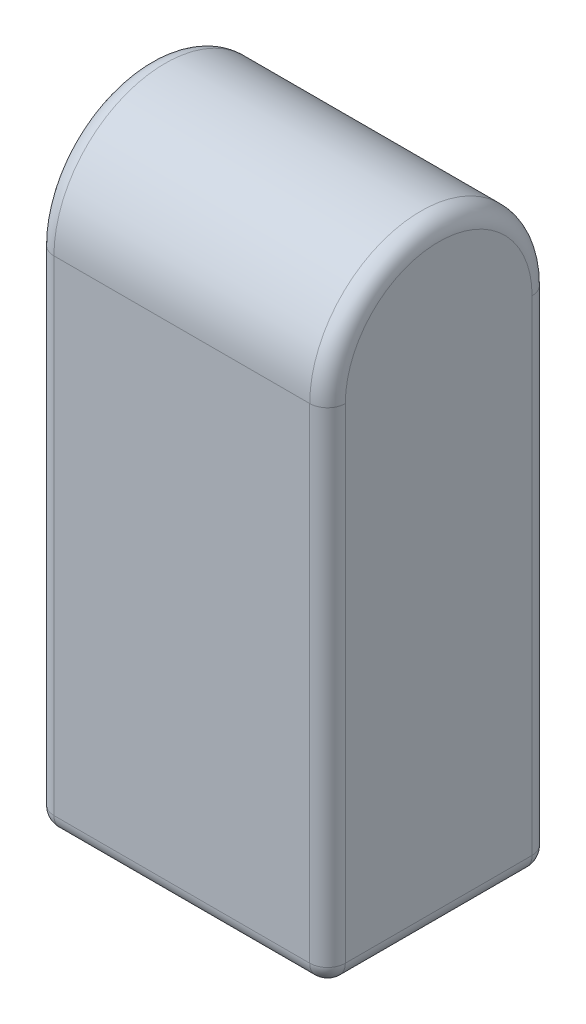
ISO-10303-21;
HEADER;
FILE_DESCRIPTION(('STEP AP214'),'2;1');
FILE_NAME('part.step','',(''),(''),'','','');
FILE_SCHEMA(('AUTOMOTIVE_DESIGN { 1 0 10303 214 1 1 1 1 }'));
ENDSEC;
DATA;
#1=APPLICATION_CONTEXT('core data for automotive mechanical design processes');
#2=APPLICATION_PROTOCOL_DEFINITION('international standard','automotive_design',2000,#1);
#3=PRODUCT_CONTEXT('',#1,'mechanical');
#4=PRODUCT('Part','Part','',(#3));
#5=PRODUCT_RELATED_PRODUCT_CATEGORY('part','',(#4));
#6=PRODUCT_DEFINITION_FORMATION('','',#4);
#7=PRODUCT_DEFINITION_CONTEXT('part definition',#1,'design');
#8=PRODUCT_DEFINITION('design','',#6,#7);
#9=PRODUCT_DEFINITION_SHAPE('','',#8);
#10=(LENGTH_UNIT() NAMED_UNIT(*) SI_UNIT(.MILLI.,.METRE.));
#11=(NAMED_UNIT(*) PLANE_ANGLE_UNIT() SI_UNIT($,.RADIAN.));
#12=(NAMED_UNIT(*) SI_UNIT($,.STERADIAN.) SOLID_ANGLE_UNIT());
#13=UNCERTAINTY_MEASURE_WITH_UNIT(LENGTH_MEASURE(1.E-05),#10,'distance_accuracy_value','');
#14=(GEOMETRIC_REPRESENTATION_CONTEXT(3) GLOBAL_UNCERTAINTY_ASSIGNED_CONTEXT((#13)) GLOBAL_UNIT_ASSIGNED_CONTEXT((#10,
#11,#12)) REPRESENTATION_CONTEXT('',''));
#15=CARTESIAN_POINT('',(0.,0.,0.));
#16=DIRECTION('',(0.,0.,1.));
#17=DIRECTION('',(1.,0.,0.));
#18=AXIS2_PLACEMENT_3D('',#15,#16,#17);
#19=CARTESIAN_POINT('',(16.383,56.5,0.));
#20=DIRECTION('',(-1.,0.,0.));
#21=DIRECTION('',(0.,0.,1.));
#22=AXIS2_PLACEMENT_3D('',#19,#20,#21);
#23=CYLINDRICAL_SURFACE('',#22,12.5);
#24=DIRECTION('',(-1.,0.,0.));
#25=VECTOR('',#24,1.);
#26=CARTESIAN_POINT('',(16.383,56.5,-12.5));
#27=LINE('',#26,#25);
#28=CARTESIAN_POINT('',(14.383,56.5,-12.5));
#29=VERTEX_POINT('',#28);
#30=CARTESIAN_POINT('',(-14.383,56.5,-12.5));
#31=VERTEX_POINT('',#30);
#32=EDGE_CURVE('E119',#29,#31,#27,.T.);
#33=ORIENTED_EDGE('',*,*,#32,.T.);
#34=CARTESIAN_POINT('',(-14.383,56.5,0.));
#35=DIRECTION('',(-1.,0.,0.));
#36=DIRECTION('',(0.,0.,1.));
#37=AXIS2_PLACEMENT_3D('',#34,#35,#36);
#38=CIRCLE('',#37,12.5);
#39=CARTESIAN_POINT('',(-14.383,56.5,12.5));
#40=VERTEX_POINT('',#39);
#41=EDGE_CURVE('E11',#31,#40,#38,.F.);
#42=ORIENTED_EDGE('',*,*,#41,.T.);
#43=DIRECTION('',(-1.,0.,0.));
#44=VECTOR('',#43,1.);
#45=CARTESIAN_POINT('',(16.383,56.5,12.5));
#46=LINE('',#45,#44);
#47=CARTESIAN_POINT('',(14.383,56.5,12.5));
#48=VERTEX_POINT('',#47);
#49=EDGE_CURVE('E121',#48,#40,#46,.T.);
#50=ORIENTED_EDGE('',*,*,#49,.F.);
#51=CARTESIAN_POINT('',(14.383,56.5,0.));
#52=DIRECTION('',(-1.,0.,0.));
#53=DIRECTION('',(0.,0.,1.));
#54=AXIS2_PLACEMENT_3D('',#51,#52,#53);
#55=CIRCLE('',#54,12.5);
#56=EDGE_CURVE('E49',#48,#29,#55,.T.);
#57=ORIENTED_EDGE('',*,*,#56,.T.);
#58=EDGE_LOOP('',(#33,#42,#50,#57));
#59=FACE_BOUND('',#58,.T.);
#60=ADVANCED_FACE('F39',(#59),#23,.T.);
#61=CARTESIAN_POINT('',(16.383,56.5,12.5));
#62=DIRECTION('',(0.,0.,-1.));
#63=DIRECTION('',(0.,1.,0.));
#64=AXIS2_PLACEMENT_3D('',#61,#62,#63);
#65=PLANE('',#64);
#66=ORIENTED_EDGE('',*,*,#49,.T.);
#67=DIRECTION('',(0.,-1.,0.));
#68=VECTOR('',#67,1.);
#69=CARTESIAN_POINT('',(-14.383,0.,12.5));
#70=LINE('',#69,#68);
#71=CARTESIAN_POINT('',(-14.383,2.,12.5));
#72=VERTEX_POINT('',#71);
#73=EDGE_CURVE('E182',#40,#72,#70,.T.);
#74=ORIENTED_EDGE('',*,*,#73,.T.);
#75=DIRECTION('',(-1.,0.,0.));
#76=VECTOR('',#75,1.);
#77=CARTESIAN_POINT('',(16.383,2.,12.5));
#78=LINE('',#77,#76);
#79=CARTESIAN_POINT('',(14.383,2.,12.5));
#80=VERTEX_POINT('',#79);
#81=EDGE_CURVE('E176',#72,#80,#78,.F.);
#82=ORIENTED_EDGE('',*,*,#81,.T.);
#83=DIRECTION('',(0.,-1.,0.));
#84=VECTOR('',#83,1.);
#85=CARTESIAN_POINT('',(14.383,56.5,12.5));
#86=LINE('',#85,#84);
#87=EDGE_CURVE('E179',#80,#48,#86,.F.);
#88=ORIENTED_EDGE('',*,*,#87,.T.);
#89=EDGE_LOOP('',(#66,#74,#82,#88));
#90=FACE_BOUND('',#89,.T.);
#91=ADVANCED_FACE('F288',(#90),#65,.F.);
#92=CARTESIAN_POINT('',(16.383,0.,12.5));
#93=DIRECTION('',(0.,1.,0.));
#94=DIRECTION('',(0.,0.,1.));
#95=AXIS2_PLACEMENT_3D('',#92,#93,#94);
#96=PLANE('',#95);
#97=DIRECTION('',(0.,0.,-1.));
#98=VECTOR('',#97,1.);
#99=CARTESIAN_POINT('',(14.383,0.,12.5));
#100=LINE('',#99,#98);
#101=CARTESIAN_POINT('',(14.383,0.,-10.5));
#102=VERTEX_POINT('',#101);
#103=CARTESIAN_POINT('',(14.383,0.,10.5));
#104=VERTEX_POINT('',#103);
#105=EDGE_CURVE('E57',#102,#104,#100,.F.);
#106=ORIENTED_EDGE('',*,*,#105,.T.);
#107=DIRECTION('',(-1.,0.,0.));
#108=VECTOR('',#107,1.);
#109=CARTESIAN_POINT('',(16.383,0.,10.5));
#110=LINE('',#109,#108);
#111=CARTESIAN_POINT('',(-14.383,0.,10.5));
#112=VERTEX_POINT('',#111);
#113=EDGE_CURVE('E127',#104,#112,#110,.T.);
#114=ORIENTED_EDGE('',*,*,#113,.T.);
#115=DIRECTION('',(0.,0.,-1.));
#116=VECTOR('',#115,1.);
#117=CARTESIAN_POINT('',(-14.383,0.,-12.5));
#118=LINE('',#117,#116);
#119=CARTESIAN_POINT('',(-14.383,0.,-10.5));
#120=VERTEX_POINT('',#119);
#121=EDGE_CURVE('E196',#112,#120,#118,.T.);
#122=ORIENTED_EDGE('',*,*,#121,.T.);
#123=DIRECTION('',(-1.,0.,0.));
#124=VECTOR('',#123,1.);
#125=CARTESIAN_POINT('',(16.383,0.,-10.5));
#126=LINE('',#125,#124);
#127=EDGE_CURVE('E62',#120,#102,#126,.F.);
#128=ORIENTED_EDGE('',*,*,#127,.T.);
#129=EDGE_LOOP('',(#106,#114,#122,#128));
#130=FACE_BOUND('',#129,.T.);
#131=ADVANCED_FACE('F302',(#130),#96,.F.);
#132=CARTESIAN_POINT('',(16.383,0.,-12.5));
#133=DIRECTION('',(0.,0.,1.));
#134=DIRECTION('',(0.,-1.,0.));
#135=AXIS2_PLACEMENT_3D('',#132,#133,#134);
#136=PLANE('',#135);
#137=DIRECTION('',(-1.,0.,0.));
#138=VECTOR('',#137,1.);
#139=CARTESIAN_POINT('',(16.383,2.,-12.5));
#140=LINE('',#139,#138);
#141=CARTESIAN_POINT('',(14.383,2.,-12.5));
#142=VERTEX_POINT('',#141);
#143=CARTESIAN_POINT('',(-14.383,2.,-12.5));
#144=VERTEX_POINT('',#143);
#145=EDGE_CURVE('E155',#142,#144,#140,.T.);
#146=ORIENTED_EDGE('',*,*,#145,.T.);
#147=DIRECTION('',(0.,1.,0.));
#148=VECTOR('',#147,1.);
#149=CARTESIAN_POINT('',(-14.383,56.5,-12.5));
#150=LINE('',#149,#148);
#151=EDGE_CURVE('E136',#144,#31,#150,.T.);
#152=ORIENTED_EDGE('',*,*,#151,.T.);
#153=ORIENTED_EDGE('',*,*,#32,.F.);
#154=DIRECTION('',(0.,1.,0.));
#155=VECTOR('',#154,1.);
#156=CARTESIAN_POINT('',(14.383,0.,-12.5));
#157=LINE('',#156,#155);
#158=EDGE_CURVE('E133',#29,#142,#157,.F.);
#159=ORIENTED_EDGE('',*,*,#158,.T.);
#160=EDGE_LOOP('',(#146,#152,#153,#159));
#161=FACE_BOUND('',#160,.T.);
#162=ADVANCED_FACE('F131',(#161),#136,.F.);
#163=CARTESIAN_POINT('',(16.383,56.5,0.));
#164=DIRECTION('',(-1.,0.,0.));
#165=DIRECTION('',(0.,0.,1.));
#166=AXIS2_PLACEMENT_3D('',#163,#164,#165);
#167=PLANE('',#166);
#168=DIRECTION('',(0.,-1.,0.));
#169=VECTOR('',#168,1.);
#170=CARTESIAN_POINT('',(16.383,56.5,10.5));
#171=LINE('',#170,#169);
#172=CARTESIAN_POINT('',(16.383,56.5,10.5));
#173=VERTEX_POINT('',#172);
#174=CARTESIAN_POINT('',(16.383,2.,10.5));
#175=VERTEX_POINT('',#174);
#176=EDGE_CURVE('E187',#173,#175,#171,.T.);
#177=ORIENTED_EDGE('',*,*,#176,.T.);
#178=DIRECTION('',(0.,0.,-1.));
#179=VECTOR('',#178,1.);
#180=CARTESIAN_POINT('',(16.383,2.,0.));
#181=LINE('',#180,#179);
#182=CARTESIAN_POINT('',(16.383,2.,-10.5));
#183=VERTEX_POINT('',#182);
#184=EDGE_CURVE('E193',#175,#183,#181,.T.);
#185=ORIENTED_EDGE('',*,*,#184,.T.);
#186=DIRECTION('',(0.,1.,0.));
#187=VECTOR('',#186,1.);
#188=CARTESIAN_POINT('',(16.383,56.5,-10.5));
#189=LINE('',#188,#187);
#190=CARTESIAN_POINT('',(16.383,56.5,-10.5));
#191=VERTEX_POINT('',#190);
#192=EDGE_CURVE('E190',#183,#191,#189,.T.);
#193=ORIENTED_EDGE('',*,*,#192,.T.);
#194=CARTESIAN_POINT('',(16.383,56.5,0.));
#195=DIRECTION('',(-1.,0.,0.));
#196=DIRECTION('',(0.,0.,1.));
#197=AXIS2_PLACEMENT_3D('',#194,#195,#196);
#198=CIRCLE('',#197,10.5);
#199=EDGE_CURVE('E142',#191,#173,#198,.F.);
#200=ORIENTED_EDGE('',*,*,#199,.T.);
#201=EDGE_LOOP('',(#177,#185,#193,#200));
#202=FACE_BOUND('',#201,.T.);
#203=ADVANCED_FACE('F261',(#202),#167,.F.);
#204=CARTESIAN_POINT('',(-16.383,56.5,0.));
#205=DIRECTION('',(-1.,0.,0.));
#206=DIRECTION('',(0.,0.,1.));
#207=AXIS2_PLACEMENT_3D('',#204,#205,#206);
#208=PLANE('',#207);
#209=DIRECTION('',(0.,1.,0.));
#210=VECTOR('',#209,1.);
#211=CARTESIAN_POINT('',(-16.383,0.,-10.5));
#212=LINE('',#211,#210);
#213=CARTESIAN_POINT('',(-16.383,56.5,-10.5));
#214=VERTEX_POINT('',#213);
#215=CARTESIAN_POINT('',(-16.383,2.,-10.5));
#216=VERTEX_POINT('',#215);
#217=EDGE_CURVE('E169',#214,#216,#212,.F.);
#218=ORIENTED_EDGE('',*,*,#217,.T.);
#219=DIRECTION('',(0.,0.,-1.));
#220=VECTOR('',#219,1.);
#221=CARTESIAN_POINT('',(-16.383,2.,12.5));
#222=LINE('',#221,#220);
#223=CARTESIAN_POINT('',(-16.383,2.,10.5));
#224=VERTEX_POINT('',#223);
#225=EDGE_CURVE('E173',#216,#224,#222,.F.);
#226=ORIENTED_EDGE('',*,*,#225,.T.);
#227=DIRECTION('',(0.,-1.,0.));
#228=VECTOR('',#227,1.);
#229=CARTESIAN_POINT('',(-16.383,56.5,10.5));
#230=LINE('',#229,#228);
#231=CARTESIAN_POINT('',(-16.383,56.5,10.5));
#232=VERTEX_POINT('',#231);
#233=EDGE_CURVE('E166',#224,#232,#230,.F.);
#234=ORIENTED_EDGE('',*,*,#233,.T.);
#235=CARTESIAN_POINT('',(-16.383,56.5,0.));
#236=DIRECTION('',(-1.,0.,0.));
#237=DIRECTION('',(0.,0.,1.));
#238=AXIS2_PLACEMENT_3D('',#235,#236,#237);
#239=CIRCLE('',#238,10.5);
#240=EDGE_CURVE('E159',#232,#214,#239,.T.);
#241=ORIENTED_EDGE('',*,*,#240,.T.);
#242=EDGE_LOOP('',(#218,#226,#234,#241));
#243=FACE_BOUND('',#242,.T.);
#244=ADVANCED_FACE('F306',(#243),#208,.T.);
#245=CARTESIAN_POINT('',(14.383,56.5,10.5));
#246=DIRECTION('',(0.,-1.,0.));
#247=DIRECTION('',(0.,0.,-1.));
#248=AXIS2_PLACEMENT_3D('',#245,#246,#247);
#249=CYLINDRICAL_SURFACE('',#248,2.);
#250=CARTESIAN_POINT('',(14.383,2.,10.5));
#251=DIRECTION('',(0.,-1.,0.));
#252=DIRECTION('',(0.,0.,-1.));
#253=AXIS2_PLACEMENT_3D('',#250,#251,#252);
#254=CIRCLE('',#253,2.);
#255=EDGE_CURVE('E249',#175,#80,#254,.T.);
#256=ORIENTED_EDGE('',*,*,#255,.F.);
#257=ORIENTED_EDGE('',*,*,#176,.F.);
#258=CARTESIAN_POINT('',(14.383,56.5,10.5));
#259=DIRECTION('',(0.,1.,0.));
#260=DIRECTION('',(0.,0.,1.));
#261=AXIS2_PLACEMENT_3D('',#258,#259,#260);
#262=CIRCLE('',#261,2.);
#263=EDGE_CURVE('E43',#48,#173,#262,.T.);
#264=ORIENTED_EDGE('',*,*,#263,.F.);
#265=ORIENTED_EDGE('',*,*,#87,.F.);
#266=EDGE_LOOP('',(#256,#257,#264,#265));
#267=FACE_BOUND('',#266,.T.);
#268=ADVANCED_FACE('F41',(#267),#249,.T.);
#269=CARTESIAN_POINT('',(14.383,56.5,0.));
#270=DIRECTION('',(-1.,0.,0.));
#271=DIRECTION('',(0.,0.,1.));
#272=AXIS2_PLACEMENT_3D('',#269,#270,#271);
#273=TOROIDAL_SURFACE('',#272,10.5,2.);
#274=ORIENTED_EDGE('',*,*,#263,.T.);
#275=ORIENTED_EDGE('',*,*,#199,.F.);
#276=CARTESIAN_POINT('',(14.383,56.5,-10.5));
#277=DIRECTION('',(0.,-1.,0.));
#278=DIRECTION('',(0.,0.,-1.));
#279=AXIS2_PLACEMENT_3D('',#276,#277,#278);
#280=CIRCLE('',#279,2.);
#281=EDGE_CURVE('E140',#29,#191,#280,.T.);
#282=ORIENTED_EDGE('',*,*,#281,.F.);
#283=ORIENTED_EDGE('',*,*,#56,.F.);
#284=EDGE_LOOP('',(#274,#275,#282,#283));
#285=FACE_BOUND('',#284,.T.);
#286=ADVANCED_FACE('F141',(#285),#273,.T.);
#287=CARTESIAN_POINT('',(14.383,2.,10.5));
#288=DIRECTION('',(1.,0.,0.));
#289=DIRECTION('',(0.,1.,0.));
#290=AXIS2_PLACEMENT_3D('',#287,#288,#289);
#291=SPHERICAL_SURFACE('',#290,2.);
#292=CARTESIAN_POINT('',(14.383,2.,10.5));
#293=DIRECTION('',(1.,0.,0.));
#294=DIRECTION('',(0.,0.,-1.));
#295=AXIS2_PLACEMENT_3D('',#292,#293,#294);
#296=CIRCLE('',#295,2.);
#297=EDGE_CURVE('E148',#104,#80,#296,.F.);
#298=ORIENTED_EDGE('',*,*,#297,.F.);
#299=CARTESIAN_POINT('',(14.383,2.,10.5));
#300=DIRECTION('',(0.,0.,1.));
#301=DIRECTION('',(1.,0.,0.));
#302=AXIS2_PLACEMENT_3D('',#299,#300,#301);
#303=CIRCLE('',#302,2.);
#304=EDGE_CURVE('E147',#175,#104,#303,.F.);
#305=ORIENTED_EDGE('',*,*,#304,.F.);
#306=ORIENTED_EDGE('',*,*,#255,.T.);
#307=EDGE_LOOP('',(#298,#305,#306));
#308=FACE_BOUND('',#307,.T.);
#309=ADVANCED_FACE('F345',(#308),#291,.T.);
#310=CARTESIAN_POINT('',(14.383,2.,0.));
#311=DIRECTION('',(0.,0.,-1.));
#312=DIRECTION('',(0.,1.,0.));
#313=AXIS2_PLACEMENT_3D('',#310,#311,#312);
#314=CYLINDRICAL_SURFACE('',#313,2.);
#315=ORIENTED_EDGE('',*,*,#304,.T.);
#316=ORIENTED_EDGE('',*,*,#105,.F.);
#317=CARTESIAN_POINT('',(14.383,2.,-10.5));
#318=DIRECTION('',(0.,0.,-1.));
#319=DIRECTION('',(-1.,0.,0.));
#320=AXIS2_PLACEMENT_3D('',#317,#318,#319);
#321=CIRCLE('',#320,2.);
#322=EDGE_CURVE('E241',#183,#102,#321,.T.);
#323=ORIENTED_EDGE('',*,*,#322,.F.);
#324=ORIENTED_EDGE('',*,*,#184,.F.);
#325=EDGE_LOOP('',(#315,#316,#323,#324));
#326=FACE_BOUND('',#325,.T.);
#327=ADVANCED_FACE('F265',(#326),#314,.T.);
#328=CARTESIAN_POINT('',(14.383,56.5,-10.5));
#329=DIRECTION('',(0.,1.,0.));
#330=DIRECTION('',(0.,0.,1.));
#331=AXIS2_PLACEMENT_3D('',#328,#329,#330);
#332=CYLINDRICAL_SURFACE('',#331,2.);
#333=ORIENTED_EDGE('',*,*,#281,.T.);
#334=ORIENTED_EDGE('',*,*,#192,.F.);
#335=CARTESIAN_POINT('',(14.383,2.,-10.5));
#336=DIRECTION('',(0.,-1.,0.));
#337=DIRECTION('',(1.,0.,0.));
#338=AXIS2_PLACEMENT_3D('',#335,#336,#337);
#339=CIRCLE('',#338,2.);
#340=EDGE_CURVE('E152',#142,#183,#339,.T.);
#341=ORIENTED_EDGE('',*,*,#340,.F.);
#342=ORIENTED_EDGE('',*,*,#158,.F.);
#343=EDGE_LOOP('',(#333,#334,#341,#342));
#344=FACE_BOUND('',#343,.T.);
#345=ADVANCED_FACE('F150',(#344),#332,.T.);
#346=CARTESIAN_POINT('',(16.383,2.,10.5));
#347=DIRECTION('',(-1.,0.,0.));
#348=DIRECTION('',(0.,0.,1.));
#349=AXIS2_PLACEMENT_3D('',#346,#347,#348);
#350=CYLINDRICAL_SURFACE('',#349,2.);
#351=ORIENTED_EDGE('',*,*,#297,.T.);
#352=ORIENTED_EDGE('',*,*,#81,.F.);
#353=CARTESIAN_POINT('',(-14.383,2.,10.5));
#354=DIRECTION('',(-1.,0.,0.));
#355=DIRECTION('',(0.,0.,1.));
#356=AXIS2_PLACEMENT_3D('',#353,#354,#355);
#357=CIRCLE('',#356,2.);
#358=EDGE_CURVE('E235',#112,#72,#357,.T.);
#359=ORIENTED_EDGE('',*,*,#358,.F.);
#360=ORIENTED_EDGE('',*,*,#113,.F.);
#361=EDGE_LOOP('',(#351,#352,#359,#360));
#362=FACE_BOUND('',#361,.T.);
#363=ADVANCED_FACE('F301',(#362),#350,.T.);
#364=CARTESIAN_POINT('',(14.383,2.,-10.5));
#365=DIRECTION('',(1.,0.,0.));
#366=DIRECTION('',(0.,1.,0.));
#367=AXIS2_PLACEMENT_3D('',#364,#365,#366);
#368=SPHERICAL_SURFACE('',#367,2.);
#369=ORIENTED_EDGE('',*,*,#340,.T.);
#370=ORIENTED_EDGE('',*,*,#322,.T.);
#371=CARTESIAN_POINT('',(14.383,2.,-10.5));
#372=DIRECTION('',(1.,0.,0.));
#373=DIRECTION('',(0.,0.,-1.));
#374=AXIS2_PLACEMENT_3D('',#371,#372,#373);
#375=CIRCLE('',#374,2.);
#376=EDGE_CURVE('E227',#142,#102,#375,.F.);
#377=ORIENTED_EDGE('',*,*,#376,.F.);
#378=EDGE_LOOP('',(#369,#370,#377));
#379=FACE_BOUND('',#378,.T.);
#380=ADVANCED_FACE('F267',(#379),#368,.T.);
#381=CARTESIAN_POINT('',(-14.383,2.,10.5));
#382=DIRECTION('',(0.,-1.,0.));
#383=DIRECTION('',(1.,0.,0.));
#384=AXIS2_PLACEMENT_3D('',#381,#382,#383);
#385=SPHERICAL_SURFACE('',#384,2.);
#386=CARTESIAN_POINT('',(-14.383,2.,10.5));
#387=DIRECTION('',(0.,-1.,0.));
#388=DIRECTION('',(0.,0.,-1.));
#389=AXIS2_PLACEMENT_3D('',#386,#387,#388);
#390=CIRCLE('',#389,2.);
#391=EDGE_CURVE('E223',#224,#72,#390,.F.);
#392=ORIENTED_EDGE('',*,*,#391,.F.);
#393=CARTESIAN_POINT('',(-14.383,2.,10.5));
#394=DIRECTION('',(0.,0.,1.));
#395=DIRECTION('',(1.,0.,0.));
#396=AXIS2_PLACEMENT_3D('',#393,#394,#395);
#397=CIRCLE('',#396,2.);
#398=EDGE_CURVE('E231',#112,#224,#397,.F.);
#399=ORIENTED_EDGE('',*,*,#398,.F.);
#400=ORIENTED_EDGE('',*,*,#358,.T.);
#401=EDGE_LOOP('',(#392,#399,#400));
#402=FACE_BOUND('',#401,.T.);
#403=ADVANCED_FACE('F297',(#402),#385,.T.);
#404=CARTESIAN_POINT('',(-14.383,2.,12.5));
#405=DIRECTION('',(0.,0.,1.));
#406=DIRECTION('',(0.,-1.,0.));
#407=AXIS2_PLACEMENT_3D('',#404,#405,#406);
#408=CYLINDRICAL_SURFACE('',#407,2.);
#409=ORIENTED_EDGE('',*,*,#398,.T.);
#410=ORIENTED_EDGE('',*,*,#225,.F.);
#411=CARTESIAN_POINT('',(-14.383,2.,-10.5));
#412=DIRECTION('',(0.,0.,-1.));
#413=DIRECTION('',(-1.,0.,0.));
#414=AXIS2_PLACEMENT_3D('',#411,#412,#413);
#415=CIRCLE('',#414,2.);
#416=EDGE_CURVE('E219',#120,#216,#415,.T.);
#417=ORIENTED_EDGE('',*,*,#416,.F.);
#418=ORIENTED_EDGE('',*,*,#121,.F.);
#419=EDGE_LOOP('',(#409,#410,#417,#418));
#420=FACE_BOUND('',#419,.T.);
#421=ADVANCED_FACE('F304',(#420),#408,.T.);
#422=CARTESIAN_POINT('',(16.383,2.,-10.5));
#423=DIRECTION('',(-1.,0.,0.));
#424=DIRECTION('',(0.,0.,1.));
#425=AXIS2_PLACEMENT_3D('',#422,#423,#424);
#426=CYLINDRICAL_SURFACE('',#425,2.);
#427=ORIENTED_EDGE('',*,*,#376,.T.);
#428=ORIENTED_EDGE('',*,*,#127,.F.);
#429=CARTESIAN_POINT('',(-14.383,2.,-10.5));
#430=DIRECTION('',(-1.,0.,0.));
#431=DIRECTION('',(0.,0.,1.));
#432=AXIS2_PLACEMENT_3D('',#429,#430,#431);
#433=CIRCLE('',#432,2.);
#434=EDGE_CURVE('E215',#144,#120,#433,.T.);
#435=ORIENTED_EDGE('',*,*,#434,.F.);
#436=ORIENTED_EDGE('',*,*,#145,.F.);
#437=EDGE_LOOP('',(#427,#428,#435,#436));
#438=FACE_BOUND('',#437,.T.);
#439=ADVANCED_FACE('F271',(#438),#426,.T.);
#440=CARTESIAN_POINT('',(-14.383,56.5,10.5));
#441=DIRECTION('',(0.,1.,0.));
#442=DIRECTION('',(0.,0.,1.));
#443=AXIS2_PLACEMENT_3D('',#440,#441,#442);
#444=CYLINDRICAL_SURFACE('',#443,2.);
#445=ORIENTED_EDGE('',*,*,#391,.T.);
#446=ORIENTED_EDGE('',*,*,#73,.F.);
#447=CARTESIAN_POINT('',(-14.383,56.5,10.5));
#448=DIRECTION('',(0.,1.,0.));
#449=DIRECTION('',(0.,0.,1.));
#450=AXIS2_PLACEMENT_3D('',#447,#448,#449);
#451=CIRCLE('',#450,2.);
#452=EDGE_CURVE('E211',#232,#40,#451,.T.);
#453=ORIENTED_EDGE('',*,*,#452,.F.);
#454=ORIENTED_EDGE('',*,*,#233,.F.);
#455=EDGE_LOOP('',(#445,#446,#453,#454));
#456=FACE_BOUND('',#455,.T.);
#457=ADVANCED_FACE('F292',(#456),#444,.T.);
#458=CARTESIAN_POINT('',(-14.383,2.,-10.5));
#459=DIRECTION('',(0.,-1.,0.));
#460=DIRECTION('',(1.,0.,0.));
#461=AXIS2_PLACEMENT_3D('',#458,#459,#460);
#462=SPHERICAL_SURFACE('',#461,2.);
#463=ORIENTED_EDGE('',*,*,#434,.T.);
#464=ORIENTED_EDGE('',*,*,#416,.T.);
#465=CARTESIAN_POINT('',(-14.383,2.,-10.5));
#466=DIRECTION('',(0.,-1.,0.));
#467=DIRECTION('',(0.,0.,-1.));
#468=AXIS2_PLACEMENT_3D('',#465,#466,#467);
#469=CIRCLE('',#468,2.);
#470=EDGE_CURVE('E208',#144,#216,#469,.F.);
#471=ORIENTED_EDGE('',*,*,#470,.F.);
#472=EDGE_LOOP('',(#463,#464,#471));
#473=FACE_BOUND('',#472,.T.);
#474=ADVANCED_FACE('F275',(#473),#462,.T.);
#475=CARTESIAN_POINT('',(-14.383,56.5,0.));
#476=DIRECTION('',(-1.,0.,0.));
#477=DIRECTION('',(0.,0.,1.));
#478=AXIS2_PLACEMENT_3D('',#475,#476,#477);
#479=TOROIDAL_SURFACE('',#478,10.5,2.);
#480=ORIENTED_EDGE('',*,*,#452,.T.);
#481=ORIENTED_EDGE('',*,*,#41,.F.);
#482=CARTESIAN_POINT('',(-14.383,56.5,-10.5));
#483=DIRECTION('',(0.,-1.,0.));
#484=DIRECTION('',(0.,0.,-1.));
#485=AXIS2_PLACEMENT_3D('',#482,#483,#484);
#486=CIRCLE('',#485,2.);
#487=EDGE_CURVE('E205',#214,#31,#486,.T.);
#488=ORIENTED_EDGE('',*,*,#487,.F.);
#489=ORIENTED_EDGE('',*,*,#240,.F.);
#490=EDGE_LOOP('',(#480,#481,#488,#489));
#491=FACE_BOUND('',#490,.T.);
#492=ADVANCED_FACE('F284',(#491),#479,.T.);
#493=CARTESIAN_POINT('',(-14.383,0.,-10.5));
#494=DIRECTION('',(0.,-1.,0.));
#495=DIRECTION('',(0.,0.,-1.));
#496=AXIS2_PLACEMENT_3D('',#493,#494,#495);
#497=CYLINDRICAL_SURFACE('',#496,2.);
#498=ORIENTED_EDGE('',*,*,#470,.T.);
#499=ORIENTED_EDGE('',*,*,#217,.F.);
#500=ORIENTED_EDGE('',*,*,#487,.T.);
#501=ORIENTED_EDGE('',*,*,#151,.F.);
#502=EDGE_LOOP('',(#498,#499,#500,#501));
#503=FACE_BOUND('',#502,.T.);
#504=ADVANCED_FACE('F279',(#503),#497,.T.);
#505=CLOSED_SHELL('',(#60,#91,#131,#162,#203,#244,#268,#286,#309,#327,#345,#363,#380,#403,#421,
#439,#457,#474,#492,#504));
#506=MANIFOLD_SOLID_BREP('B2',#505);
#507=ADVANCED_BREP_SHAPE_REPRESENTATION('',(#18,#506),#14);
#508=SHAPE_DEFINITION_REPRESENTATION(#9,#507);
ENDSEC;
END-ISO-10303-21;
